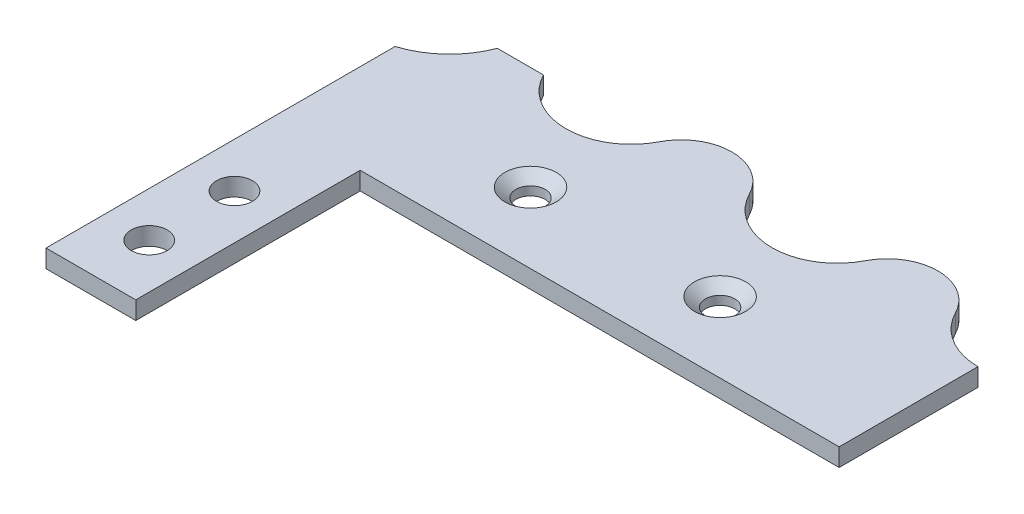
ISO-10303-21;
HEADER;
FILE_DESCRIPTION(('STEP AP214'),'2;1');
FILE_NAME('part.step','',(''),(''),'','','');
FILE_SCHEMA(('AUTOMOTIVE_DESIGN { 1 0 10303 214 1 1 1 1 }'));
ENDSEC;
DATA;
#1=APPLICATION_CONTEXT('core data for automotive mechanical design processes');
#2=APPLICATION_PROTOCOL_DEFINITION('international standard','automotive_design',2000,#1);
#3=PRODUCT_CONTEXT('',#1,'mechanical');
#4=PRODUCT('Part','Part','',(#3));
#5=PRODUCT_RELATED_PRODUCT_CATEGORY('part','',(#4));
#6=PRODUCT_DEFINITION_FORMATION('','',#4);
#7=PRODUCT_DEFINITION_CONTEXT('part definition',#1,'design');
#8=PRODUCT_DEFINITION('design','',#6,#7);
#9=PRODUCT_DEFINITION_SHAPE('','',#8);
#10=(LENGTH_UNIT() NAMED_UNIT(*) SI_UNIT(.MILLI.,.METRE.));
#11=(NAMED_UNIT(*) PLANE_ANGLE_UNIT() SI_UNIT($,.RADIAN.));
#12=(NAMED_UNIT(*) SI_UNIT($,.STERADIAN.) SOLID_ANGLE_UNIT());
#13=UNCERTAINTY_MEASURE_WITH_UNIT(LENGTH_MEASURE(1.E-05),#10,'distance_accuracy_value','');
#14=(GEOMETRIC_REPRESENTATION_CONTEXT(3) GLOBAL_UNCERTAINTY_ASSIGNED_CONTEXT((#13)) GLOBAL_UNIT_ASSIGNED_CONTEXT((#10,
#11,#12)) REPRESENTATION_CONTEXT('',''));
#15=CARTESIAN_POINT('',(0.,0.,0.));
#16=DIRECTION('',(0.,0.,1.));
#17=DIRECTION('',(1.,0.,0.));
#18=AXIS2_PLACEMENT_3D('',#15,#16,#17);
#19=CARTESIAN_POINT('',(11.475,-2.,5.88976892943899));
#20=DIRECTION('',(0.,1.,0.));
#21=DIRECTION('',(0.,0.,1.));
#22=AXIS2_PLACEMENT_3D('',#19,#20,#21);
#23=PLANE('',#22);
#24=CARTESIAN_POINT('',(1.83,-2.,14.86));
#25=DIRECTION('',(0.,1.,0.));
#26=DIRECTION('',(0.,0.,1.));
#27=AXIS2_PLACEMENT_3D('',#24,#25,#26);
#28=CIRCLE('',#27,1.63194999999999);
#29=CARTESIAN_POINT('',(1.83,-2.,16.49195));
#30=VERTEX_POINT('',#29);
#31=EDGE_CURVE('E501',#30,#30,#28,.F.);
#32=ORIENTED_EDGE('',*,*,#31,.F.);
#33=EDGE_LOOP('',(#32));
#34=FACE_BOUND('',#33,.T.);
#35=CARTESIAN_POINT('',(-35.41,-2.,41.22));
#36=DIRECTION('',(0.,1.,0.));
#37=DIRECTION('',(0.,0.,1.));
#38=AXIS2_PLACEMENT_3D('',#35,#36,#37);
#39=CIRCLE('',#38,2.00000000000001);
#40=CARTESIAN_POINT('',(-35.41,-2.,43.22));
#41=VERTEX_POINT('',#40);
#42=EDGE_CURVE('E180',#41,#41,#39,.F.);
#43=ORIENTED_EDGE('',*,*,#42,.F.);
#44=EDGE_LOOP('',(#43));
#45=FACE_BOUND('',#44,.T.);
#46=CARTESIAN_POINT('',(-35.41,-2.,31.72));
#47=DIRECTION('',(0.,1.,0.));
#48=DIRECTION('',(0.,0.,1.));
#49=AXIS2_PLACEMENT_3D('',#46,#47,#48);
#50=CIRCLE('',#49,2.00000000000001);
#51=CARTESIAN_POINT('',(-35.41,-2.,33.72));
#52=VERTEX_POINT('',#51);
#53=EDGE_CURVE('E298',#52,#52,#50,.F.);
#54=ORIENTED_EDGE('',*,*,#53,.F.);
#55=EDGE_LOOP('',(#54));
#56=FACE_BOUND('',#55,.T.);
#57=CARTESIAN_POINT('',(11.475,-2.,5.88976892943899));
#58=DIRECTION('',(0.,1.,0.));
#59=DIRECTION('',(0.,0.,1.));
#60=AXIS2_PLACEMENT_3D('',#57,#58,#59);
#61=CIRCLE('',#60,5.64825581395349);
#62=CARTESIAN_POINT('',(16.5,-2.,3.31058907144937));
#63=VERTEX_POINT('',#62);
#64=CARTESIAN_POINT('',(6.45,-2.,3.31058907144937));
#65=VERTEX_POINT('',#64);
#66=EDGE_CURVE('E220',#63,#65,#61,.T.);
#67=ORIENTED_EDGE('',*,*,#66,.F.);
#68=CARTESIAN_POINT('',(22.95,-2.,0.));
#69=DIRECTION('',(0.,-1.,0.));
#70=DIRECTION('',(0.,0.,1.));
#71=AXIS2_PLACEMENT_3D('',#68,#69,#70);
#72=CIRCLE('',#71,7.25);
#73=CARTESIAN_POINT('',(22.95,-2.,7.25));
#74=VERTEX_POINT('',#73);
#75=EDGE_CURVE('E161',#74,#63,#72,.T.);
#76=ORIENTED_EDGE('',*,*,#75,.F.);
#77=DIRECTION('',(0.,0.,-1.));
#78=VECTOR('',#77,1.);
#79=CARTESIAN_POINT('',(22.95,-2.,7.25));
#80=LINE('',#79,#78);
#81=CARTESIAN_POINT('',(22.95,-2.,22.72));
#82=VERTEX_POINT('',#81);
#83=EDGE_CURVE('E145',#82,#74,#80,.T.);
#84=ORIENTED_EDGE('',*,*,#83,.F.);
#85=DIRECTION('',(1.,0.,0.));
#86=VECTOR('',#85,1.);
#87=CARTESIAN_POINT('',(-30.41,-2.,22.72));
#88=LINE('',#87,#86);
#89=CARTESIAN_POINT('',(-30.41,-2.,22.72));
#90=VERTEX_POINT('',#89);
#91=EDGE_CURVE('E159',#90,#82,#88,.T.);
#92=ORIENTED_EDGE('',*,*,#91,.F.);
#93=DIRECTION('',(0.,0.,-1.));
#94=VECTOR('',#93,1.);
#95=CARTESIAN_POINT('',(-30.41,-2.,47.72));
#96=LINE('',#95,#94);
#97=CARTESIAN_POINT('',(-30.41,-2.,47.72));
#98=VERTEX_POINT('',#97);
#99=EDGE_CURVE('E166',#98,#90,#96,.T.);
#100=ORIENTED_EDGE('',*,*,#99,.F.);
#101=DIRECTION('',(1.,0.,0.));
#102=VECTOR('',#101,1.);
#103=CARTESIAN_POINT('',(-40.41,-2.,47.72));
#104=LINE('',#103,#102);
#105=CARTESIAN_POINT('',(-40.41,-2.,47.72));
#106=VERTEX_POINT('',#105);
#107=EDGE_CURVE('E169',#106,#98,#104,.T.);
#108=ORIENTED_EDGE('',*,*,#107,.F.);
#109=DIRECTION('',(0.,0.,1.));
#110=VECTOR('',#109,1.);
#111=CARTESIAN_POINT('',(-40.41,-2.,8.8294926680762));
#112=LINE('',#111,#110);
#113=CARTESIAN_POINT('',(-40.41,-2.,8.82949266807619));
#114=VERTEX_POINT('',#113);
#115=EDGE_CURVE('E332',#114,#106,#112,.T.);
#116=ORIENTED_EDGE('',*,*,#115,.F.);
#117=CARTESIAN_POINT('',(-43.1672738754771,-2.,0.));
#118=DIRECTION('',(0.,-1.,0.));
#119=DIRECTION('',(0.,0.,-1.));
#120=AXIS2_PLACEMENT_3D('',#117,#118,#119);
#121=CIRCLE('',#120,9.25);
#122=CARTESIAN_POINT('',(-34.53,-2.,3.31058907144937));
#123=VERTEX_POINT('',#122);
#124=EDGE_CURVE('E328',#123,#114,#121,.T.);
#125=ORIENTED_EDGE('',*,*,#124,.F.);
#126=DIRECTION('',(-1.,0.,0.));
#127=VECTOR('',#126,1.);
#128=CARTESIAN_POINT('',(-29.4,-2.,3.31058907144937));
#129=LINE('',#128,#127);
#130=CARTESIAN_POINT('',(-29.4,-2.,3.31058907144937));
#131=VERTEX_POINT('',#130);
#132=EDGE_CURVE('E324',#131,#123,#129,.T.);
#133=ORIENTED_EDGE('',*,*,#132,.F.);
#134=CARTESIAN_POINT('',(-22.95,-2.,0.));
#135=DIRECTION('',(0.,-1.,0.));
#136=DIRECTION('',(0.,0.,-1.));
#137=AXIS2_PLACEMENT_3D('',#134,#135,#136);
#138=CIRCLE('',#137,7.25);
#139=CARTESIAN_POINT('',(-16.5,-2.,3.31058907144937));
#140=VERTEX_POINT('',#139);
#141=EDGE_CURVE('E320',#140,#131,#138,.T.);
#142=ORIENTED_EDGE('',*,*,#141,.F.);
#143=CARTESIAN_POINT('',(-11.475,-2.,5.88976892943899));
#144=DIRECTION('',(0.,1.,0.));
#145=DIRECTION('',(0.,0.,-1.));
#146=AXIS2_PLACEMENT_3D('',#143,#144,#145);
#147=CIRCLE('',#146,5.64825581395349);
#148=CARTESIAN_POINT('',(-6.45,-2.,3.31058907144937));
#149=VERTEX_POINT('',#148);
#150=EDGE_CURVE('E316',#149,#140,#147,.T.);
#151=ORIENTED_EDGE('',*,*,#150,.F.);
#152=CARTESIAN_POINT('',(0.,-2.,0.));
#153=DIRECTION('',(0.,-1.,0.));
#154=DIRECTION('',(0.,0.,-1.));
#155=AXIS2_PLACEMENT_3D('',#152,#153,#154);
#156=CIRCLE('',#155,7.25);
#157=EDGE_CURVE('E313',#65,#149,#156,.T.);
#158=ORIENTED_EDGE('',*,*,#157,.F.);
#159=EDGE_LOOP('',(#67,#76,#84,#92,#100,#108,#116,#125,#133,#142,#151,#158));
#160=FACE_BOUND('',#159,.T.);
#161=CARTESIAN_POINT('',(-19.29,-2.,14.86));
#162=DIRECTION('',(0.,1.,0.));
#163=DIRECTION('',(0.,0.,1.));
#164=AXIS2_PLACEMENT_3D('',#161,#162,#163);
#165=CIRCLE('',#164,1.63194999999999);
#166=CARTESIAN_POINT('',(-19.29,-2.,16.49195));
#167=VERTEX_POINT('',#166);
#168=EDGE_CURVE('E299',#167,#167,#165,.F.);
#169=ORIENTED_EDGE('',*,*,#168,.F.);
#170=EDGE_LOOP('',(#169));
#171=FACE_BOUND('',#170,.T.);
#172=ADVANCED_FACE('F47',(#34,#45,#56,#160,#171),#23,.F.);
#173=CARTESIAN_POINT('',(11.475,-2.,5.88976892943899));
#174=DIRECTION('',(0.,1.,0.));
#175=DIRECTION('',(0.,0.,1.));
#176=AXIS2_PLACEMENT_3D('',#173,#174,#175);
#177=CYLINDRICAL_SURFACE('',#176,5.64825581395349);
#178=CARTESIAN_POINT('',(11.475,0.,5.88976892943899));
#179=DIRECTION('',(0.,1.,0.));
#180=DIRECTION('',(0.,0.,1.));
#181=AXIS2_PLACEMENT_3D('',#178,#179,#180);
#182=CIRCLE('',#181,5.64825581395349);
#183=CARTESIAN_POINT('',(16.5,0.,3.31058907144937));
#184=VERTEX_POINT('',#183);
#185=CARTESIAN_POINT('',(6.45,0.,3.31058907144937));
#186=VERTEX_POINT('',#185);
#187=EDGE_CURVE('E175',#184,#186,#182,.T.);
#188=ORIENTED_EDGE('',*,*,#187,.F.);
#189=DIRECTION('',(0.,1.,0.));
#190=VECTOR('',#189,1.);
#191=CARTESIAN_POINT('',(16.5,-2.,3.31058907144937));
#192=LINE('',#191,#190);
#193=EDGE_CURVE('E11',#63,#184,#192,.T.);
#194=ORIENTED_EDGE('',*,*,#193,.F.);
#195=ORIENTED_EDGE('',*,*,#66,.T.);
#196=DIRECTION('',(0.,1.,0.));
#197=VECTOR('',#196,1.);
#198=CARTESIAN_POINT('',(6.45,-2.,3.31058907144937));
#199=LINE('',#198,#197);
#200=EDGE_CURVE('E51',#65,#186,#199,.T.);
#201=ORIENTED_EDGE('',*,*,#200,.T.);
#202=EDGE_LOOP('',(#188,#194,#195,#201));
#203=FACE_BOUND('',#202,.T.);
#204=ADVANCED_FACE('F49',(#203),#177,.T.);
#205=CARTESIAN_POINT('',(22.95,-2.,0.));
#206=DIRECTION('',(0.,1.,0.));
#207=DIRECTION('',(0.,0.,1.));
#208=AXIS2_PLACEMENT_3D('',#205,#206,#207);
#209=CYLINDRICAL_SURFACE('',#208,7.25);
#210=CARTESIAN_POINT('',(22.95,0.,0.));
#211=DIRECTION('',(0.,-1.,0.));
#212=DIRECTION('',(0.,0.,1.));
#213=AXIS2_PLACEMENT_3D('',#210,#211,#212);
#214=CIRCLE('',#213,7.25);
#215=CARTESIAN_POINT('',(22.95,0.,7.25));
#216=VERTEX_POINT('',#215);
#217=EDGE_CURVE('E217',#216,#184,#214,.T.);
#218=ORIENTED_EDGE('',*,*,#217,.F.);
#219=DIRECTION('',(0.,1.,0.));
#220=VECTOR('',#219,1.);
#221=CARTESIAN_POINT('',(22.95,-2.,7.25));
#222=LINE('',#221,#220);
#223=EDGE_CURVE('E58',#74,#216,#222,.T.);
#224=ORIENTED_EDGE('',*,*,#223,.F.);
#225=ORIENTED_EDGE('',*,*,#75,.T.);
#226=ORIENTED_EDGE('',*,*,#193,.T.);
#227=EDGE_LOOP('',(#218,#224,#225,#226));
#228=FACE_BOUND('',#227,.T.);
#229=ADVANCED_FACE('F251',(#228),#209,.F.);
#230=CARTESIAN_POINT('',(22.95,-2.,7.25));
#231=DIRECTION('',(1.,0.,0.));
#232=DIRECTION('',(0.,0.,-1.));
#233=AXIS2_PLACEMENT_3D('',#230,#231,#232);
#234=PLANE('',#233);
#235=DIRECTION('',(0.,0.,-1.));
#236=VECTOR('',#235,1.);
#237=CARTESIAN_POINT('',(22.95,0.,7.25));
#238=LINE('',#237,#236);
#239=CARTESIAN_POINT('',(22.95,0.,22.72));
#240=VERTEX_POINT('',#239);
#241=EDGE_CURVE('E147',#240,#216,#238,.T.);
#242=ORIENTED_EDGE('',*,*,#241,.F.);
#243=DIRECTION('',(0.,1.,0.));
#244=VECTOR('',#243,1.);
#245=CARTESIAN_POINT('',(22.95,-2.,22.72));
#246=LINE('',#245,#244);
#247=EDGE_CURVE('E142',#82,#240,#246,.T.);
#248=ORIENTED_EDGE('',*,*,#247,.F.);
#249=ORIENTED_EDGE('',*,*,#83,.T.);
#250=ORIENTED_EDGE('',*,*,#223,.T.);
#251=EDGE_LOOP('',(#242,#248,#249,#250));
#252=FACE_BOUND('',#251,.T.);
#253=ADVANCED_FACE('F144',(#252),#234,.T.);
#254=CARTESIAN_POINT('',(-30.41,-2.,22.72));
#255=DIRECTION('',(0.,0.,1.));
#256=DIRECTION('',(1.,0.,0.));
#257=AXIS2_PLACEMENT_3D('',#254,#255,#256);
#258=PLANE('',#257);
#259=DIRECTION('',(1.,0.,0.));
#260=VECTOR('',#259,1.);
#261=CARTESIAN_POINT('',(-30.41,0.,22.72));
#262=LINE('',#261,#260);
#263=CARTESIAN_POINT('',(-30.41,0.,22.72));
#264=VERTEX_POINT('',#263);
#265=EDGE_CURVE('E212',#264,#240,#262,.T.);
#266=ORIENTED_EDGE('',*,*,#265,.F.);
#267=DIRECTION('',(0.,1.,0.));
#268=VECTOR('',#267,1.);
#269=CARTESIAN_POINT('',(-30.41,-2.,22.72));
#270=LINE('',#269,#268);
#271=EDGE_CURVE('E153',#90,#264,#270,.T.);
#272=ORIENTED_EDGE('',*,*,#271,.F.);
#273=ORIENTED_EDGE('',*,*,#91,.T.);
#274=ORIENTED_EDGE('',*,*,#247,.T.);
#275=EDGE_LOOP('',(#266,#272,#273,#274));
#276=FACE_BOUND('',#275,.T.);
#277=ADVANCED_FACE('F164',(#276),#258,.T.);
#278=CARTESIAN_POINT('',(-30.41,-2.,47.72));
#279=DIRECTION('',(1.,0.,0.));
#280=DIRECTION('',(0.,0.,-1.));
#281=AXIS2_PLACEMENT_3D('',#278,#279,#280);
#282=PLANE('',#281);
#283=DIRECTION('',(0.,0.,-1.));
#284=VECTOR('',#283,1.);
#285=CARTESIAN_POINT('',(-30.41,0.,47.72));
#286=LINE('',#285,#284);
#287=CARTESIAN_POINT('',(-30.41,0.,47.72));
#288=VERTEX_POINT('',#287);
#289=EDGE_CURVE('E208',#288,#264,#286,.T.);
#290=ORIENTED_EDGE('',*,*,#289,.F.);
#291=DIRECTION('',(0.,1.,0.));
#292=VECTOR('',#291,1.);
#293=CARTESIAN_POINT('',(-30.41,-2.,47.72));
#294=LINE('',#293,#292);
#295=EDGE_CURVE('E226',#98,#288,#294,.T.);
#296=ORIENTED_EDGE('',*,*,#295,.F.);
#297=ORIENTED_EDGE('',*,*,#99,.T.);
#298=ORIENTED_EDGE('',*,*,#271,.T.);
#299=EDGE_LOOP('',(#290,#296,#297,#298));
#300=FACE_BOUND('',#299,.T.);
#301=ADVANCED_FACE('F345',(#300),#282,.T.);
#302=CARTESIAN_POINT('',(-40.41,-2.,47.72));
#303=DIRECTION('',(0.,0.,1.));
#304=DIRECTION('',(1.,0.,0.));
#305=AXIS2_PLACEMENT_3D('',#302,#303,#304);
#306=PLANE('',#305);
#307=DIRECTION('',(1.,0.,0.));
#308=VECTOR('',#307,1.);
#309=CARTESIAN_POINT('',(-40.41,0.,47.72));
#310=LINE('',#309,#308);
#311=CARTESIAN_POINT('',(-40.41,0.,47.72));
#312=VERTEX_POINT('',#311);
#313=EDGE_CURVE('E204',#312,#288,#310,.T.);
#314=ORIENTED_EDGE('',*,*,#313,.F.);
#315=DIRECTION('',(0.,1.,0.));
#316=VECTOR('',#315,1.);
#317=CARTESIAN_POINT('',(-40.41,-2.,47.72));
#318=LINE('',#317,#316);
#319=EDGE_CURVE('E229',#106,#312,#318,.T.);
#320=ORIENTED_EDGE('',*,*,#319,.F.);
#321=ORIENTED_EDGE('',*,*,#107,.T.);
#322=ORIENTED_EDGE('',*,*,#295,.T.);
#323=EDGE_LOOP('',(#314,#320,#321,#322));
#324=FACE_BOUND('',#323,.T.);
#325=ADVANCED_FACE('F340',(#324),#306,.T.);
#326=CARTESIAN_POINT('',(-40.41,-2.,22.72));
#327=DIRECTION('',(-1.,0.,0.));
#328=DIRECTION('',(0.,0.,1.));
#329=AXIS2_PLACEMENT_3D('',#326,#327,#328);
#330=PLANE('',#329);
#331=DIRECTION('',(0.,0.,1.));
#332=VECTOR('',#331,1.);
#333=CARTESIAN_POINT('',(-40.41,0.,22.72));
#334=LINE('',#333,#332);
#335=CARTESIAN_POINT('',(-40.41,0.,8.82949266807619));
#336=VERTEX_POINT('',#335);
#337=EDGE_CURVE('E200',#336,#312,#334,.T.);
#338=ORIENTED_EDGE('',*,*,#337,.F.);
#339=DIRECTION('',(0.,1.,0.));
#340=VECTOR('',#339,1.);
#341=CARTESIAN_POINT('',(-40.41,-2.,8.82949266807619));
#342=LINE('',#341,#340);
#343=EDGE_CURVE('E232',#114,#336,#342,.T.);
#344=ORIENTED_EDGE('',*,*,#343,.F.);
#345=ORIENTED_EDGE('',*,*,#115,.T.);
#346=ORIENTED_EDGE('',*,*,#319,.T.);
#347=EDGE_LOOP('',(#338,#344,#345,#346));
#348=FACE_BOUND('',#347,.T.);
#349=ADVANCED_FACE('F348',(#348),#330,.T.);
#350=CARTESIAN_POINT('',(-43.1672738754771,-2.,0.));
#351=DIRECTION('',(0.,1.,0.));
#352=DIRECTION('',(0.,0.,1.));
#353=AXIS2_PLACEMENT_3D('',#350,#351,#352);
#354=CYLINDRICAL_SURFACE('',#353,9.25);
#355=CARTESIAN_POINT('',(-43.1672738754771,0.,0.));
#356=DIRECTION('',(0.,-1.,0.));
#357=DIRECTION('',(0.,0.,-1.));
#358=AXIS2_PLACEMENT_3D('',#355,#356,#357);
#359=CIRCLE('',#358,9.25);
#360=CARTESIAN_POINT('',(-34.53,0.,3.31058907144937));
#361=VERTEX_POINT('',#360);
#362=EDGE_CURVE('E196',#361,#336,#359,.T.);
#363=ORIENTED_EDGE('',*,*,#362,.F.);
#364=DIRECTION('',(0.,1.,0.));
#365=VECTOR('',#364,1.);
#366=CARTESIAN_POINT('',(-34.53,-2.,3.31058907144937));
#367=LINE('',#366,#365);
#368=EDGE_CURVE('E236',#123,#361,#367,.T.);
#369=ORIENTED_EDGE('',*,*,#368,.F.);
#370=ORIENTED_EDGE('',*,*,#124,.T.);
#371=ORIENTED_EDGE('',*,*,#343,.T.);
#372=EDGE_LOOP('',(#363,#369,#370,#371));
#373=FACE_BOUND('',#372,.T.);
#374=ADVANCED_FACE('F350',(#373),#354,.F.);
#375=CARTESIAN_POINT('',(-29.4,-2.,3.31058907144937));
#376=DIRECTION('',(0.,0.,-1.));
#377=DIRECTION('',(-1.,0.,0.));
#378=AXIS2_PLACEMENT_3D('',#375,#376,#377);
#379=PLANE('',#378);
#380=DIRECTION('',(-1.,0.,0.));
#381=VECTOR('',#380,1.);
#382=CARTESIAN_POINT('',(-29.4,0.,3.31058907144937));
#383=LINE('',#382,#381);
#384=CARTESIAN_POINT('',(-29.4,0.,3.31058907144937));
#385=VERTEX_POINT('',#384);
#386=EDGE_CURVE('E192',#385,#361,#383,.T.);
#387=ORIENTED_EDGE('',*,*,#386,.F.);
#388=DIRECTION('',(0.,1.,0.));
#389=VECTOR('',#388,1.);
#390=CARTESIAN_POINT('',(-29.4,-2.,3.31058907144937));
#391=LINE('',#390,#389);
#392=EDGE_CURVE('E239',#131,#385,#391,.T.);
#393=ORIENTED_EDGE('',*,*,#392,.F.);
#394=ORIENTED_EDGE('',*,*,#132,.T.);
#395=ORIENTED_EDGE('',*,*,#368,.T.);
#396=EDGE_LOOP('',(#387,#393,#394,#395));
#397=FACE_BOUND('',#396,.T.);
#398=ADVANCED_FACE('F355',(#397),#379,.T.);
#399=CARTESIAN_POINT('',(-22.95,-2.,0.));
#400=DIRECTION('',(0.,1.,0.));
#401=DIRECTION('',(0.,0.,1.));
#402=AXIS2_PLACEMENT_3D('',#399,#400,#401);
#403=CYLINDRICAL_SURFACE('',#402,7.25);
#404=CARTESIAN_POINT('',(-22.95,0.,0.));
#405=DIRECTION('',(0.,-1.,0.));
#406=DIRECTION('',(0.,0.,-1.));
#407=AXIS2_PLACEMENT_3D('',#404,#405,#406);
#408=CIRCLE('',#407,7.25);
#409=CARTESIAN_POINT('',(-16.5,0.,3.31058907144937));
#410=VERTEX_POINT('',#409);
#411=EDGE_CURVE('E188',#410,#385,#408,.T.);
#412=ORIENTED_EDGE('',*,*,#411,.F.);
#413=DIRECTION('',(0.,1.,0.));
#414=VECTOR('',#413,1.);
#415=CARTESIAN_POINT('',(-16.5,-2.,3.31058907144937));
#416=LINE('',#415,#414);
#417=EDGE_CURVE('E242',#140,#410,#416,.T.);
#418=ORIENTED_EDGE('',*,*,#417,.F.);
#419=ORIENTED_EDGE('',*,*,#141,.T.);
#420=ORIENTED_EDGE('',*,*,#392,.T.);
#421=EDGE_LOOP('',(#412,#418,#419,#420));
#422=FACE_BOUND('',#421,.T.);
#423=ADVANCED_FACE('F358',(#422),#403,.F.);
#424=CARTESIAN_POINT('',(-11.475,-2.,5.88976892943899));
#425=DIRECTION('',(0.,1.,0.));
#426=DIRECTION('',(0.,0.,1.));
#427=AXIS2_PLACEMENT_3D('',#424,#425,#426);
#428=CYLINDRICAL_SURFACE('',#427,5.64825581395349);
#429=CARTESIAN_POINT('',(-11.475,0.,5.88976892943899));
#430=DIRECTION('',(0.,1.,0.));
#431=DIRECTION('',(0.,0.,-1.));
#432=AXIS2_PLACEMENT_3D('',#429,#430,#431);
#433=CIRCLE('',#432,5.64825581395349);
#434=CARTESIAN_POINT('',(-6.45,0.,3.31058907144937));
#435=VERTEX_POINT('',#434);
#436=EDGE_CURVE('E184',#435,#410,#433,.T.);
#437=ORIENTED_EDGE('',*,*,#436,.F.);
#438=DIRECTION('',(0.,1.,0.));
#439=VECTOR('',#438,1.);
#440=CARTESIAN_POINT('',(-6.45,-2.,3.31058907144937));
#441=LINE('',#440,#439);
#442=EDGE_CURVE('E244',#149,#435,#441,.T.);
#443=ORIENTED_EDGE('',*,*,#442,.F.);
#444=ORIENTED_EDGE('',*,*,#150,.T.);
#445=ORIENTED_EDGE('',*,*,#417,.T.);
#446=EDGE_LOOP('',(#437,#443,#444,#445));
#447=FACE_BOUND('',#446,.T.);
#448=ADVANCED_FACE('F280',(#447),#428,.T.);
#449=CARTESIAN_POINT('',(0.,-2.,0.));
#450=DIRECTION('',(0.,1.,0.));
#451=DIRECTION('',(0.,0.,1.));
#452=AXIS2_PLACEMENT_3D('',#449,#450,#451);
#453=CYLINDRICAL_SURFACE('',#452,7.25);
#454=CARTESIAN_POINT('',(0.,0.,0.));
#455=DIRECTION('',(0.,-1.,0.));
#456=DIRECTION('',(0.,0.,-1.));
#457=AXIS2_PLACEMENT_3D('',#454,#455,#456);
#458=CIRCLE('',#457,7.25);
#459=EDGE_CURVE('E179',#186,#435,#458,.T.);
#460=ORIENTED_EDGE('',*,*,#459,.F.);
#461=ORIENTED_EDGE('',*,*,#200,.F.);
#462=ORIENTED_EDGE('',*,*,#157,.T.);
#463=ORIENTED_EDGE('',*,*,#442,.T.);
#464=EDGE_LOOP('',(#460,#461,#462,#463));
#465=FACE_BOUND('',#464,.T.);
#466=ADVANCED_FACE('F248',(#465),#453,.F.);
#467=CARTESIAN_POINT('',(11.475,0.,5.88976892943899));
#468=DIRECTION('',(0.,1.,0.));
#469=DIRECTION('',(0.,0.,1.));
#470=AXIS2_PLACEMENT_3D('',#467,#468,#469);
#471=PLANE('',#470);
#472=CARTESIAN_POINT('',(1.83,0.,14.86));
#473=DIRECTION('',(0.,1.,0.));
#474=DIRECTION('',(0.,0.,1.));
#475=AXIS2_PLACEMENT_3D('',#472,#473,#474);
#476=CIRCLE('',#475,2.8575);
#477=CARTESIAN_POINT('',(1.83,0.,17.7175));
#478=VERTEX_POINT('',#477);
#479=EDGE_CURVE('E284',#478,#478,#476,.T.);
#480=ORIENTED_EDGE('',*,*,#479,.F.);
#481=EDGE_LOOP('',(#480));
#482=FACE_BOUND('',#481,.T.);
#483=CARTESIAN_POINT('',(-19.29,0.,14.86));
#484=DIRECTION('',(0.,1.,0.));
#485=DIRECTION('',(0.,0.,1.));
#486=AXIS2_PLACEMENT_3D('',#483,#484,#485);
#487=CIRCLE('',#486,2.8575);
#488=CARTESIAN_POINT('',(-19.29,0.,17.7175));
#489=VERTEX_POINT('',#488);
#490=EDGE_CURVE('E288',#489,#489,#487,.T.);
#491=ORIENTED_EDGE('',*,*,#490,.F.);
#492=EDGE_LOOP('',(#491));
#493=FACE_BOUND('',#492,.T.);
#494=CARTESIAN_POINT('',(-35.41,0.,41.22));
#495=DIRECTION('',(0.,1.,0.));
#496=DIRECTION('',(0.,0.,1.));
#497=AXIS2_PLACEMENT_3D('',#494,#495,#496);
#498=CIRCLE('',#497,2.00000000000001);
#499=CARTESIAN_POINT('',(-35.41,0.,43.22));
#500=VERTEX_POINT('',#499);
#501=EDGE_CURVE('E292',#500,#500,#498,.T.);
#502=ORIENTED_EDGE('',*,*,#501,.F.);
#503=EDGE_LOOP('',(#502));
#504=FACE_BOUND('',#503,.T.);
#505=CARTESIAN_POINT('',(-35.41,0.,31.72));
#506=DIRECTION('',(0.,1.,0.));
#507=DIRECTION('',(0.,0.,1.));
#508=AXIS2_PLACEMENT_3D('',#505,#506,#507);
#509=CIRCLE('',#508,2.00000000000001);
#510=CARTESIAN_POINT('',(-35.41,0.,33.72));
#511=VERTEX_POINT('',#510);
#512=EDGE_CURVE('E295',#511,#511,#509,.T.);
#513=ORIENTED_EDGE('',*,*,#512,.F.);
#514=EDGE_LOOP('',(#513));
#515=FACE_BOUND('',#514,.T.);
#516=ORIENTED_EDGE('',*,*,#187,.T.);
#517=ORIENTED_EDGE('',*,*,#459,.T.);
#518=ORIENTED_EDGE('',*,*,#436,.T.);
#519=ORIENTED_EDGE('',*,*,#411,.T.);
#520=ORIENTED_EDGE('',*,*,#386,.T.);
#521=ORIENTED_EDGE('',*,*,#362,.T.);
#522=ORIENTED_EDGE('',*,*,#337,.T.);
#523=ORIENTED_EDGE('',*,*,#313,.T.);
#524=ORIENTED_EDGE('',*,*,#289,.T.);
#525=ORIENTED_EDGE('',*,*,#265,.T.);
#526=ORIENTED_EDGE('',*,*,#241,.T.);
#527=ORIENTED_EDGE('',*,*,#217,.T.);
#528=EDGE_LOOP('',(#516,#517,#518,#519,#520,#521,#522,#523,#524,#525,#526,#527));
#529=FACE_BOUND('',#528,.T.);
#530=ADVANCED_FACE('F250',(#482,#493,#504,#515,#529),#471,.T.);
#531=CARTESIAN_POINT('',(-35.41,-7.65685424949241,31.72));
#532=DIRECTION('',(0.,1.,0.));
#533=DIRECTION('',(0.,0.,1.));
#534=AXIS2_PLACEMENT_3D('',#531,#532,#533);
#535=CYLINDRICAL_SURFACE('',#534,2.00000000000001);
#536=ORIENTED_EDGE('',*,*,#53,.T.);
#537=EDGE_LOOP('',(#536));
#538=FACE_BOUND('',#537,.T.);
#539=ORIENTED_EDGE('',*,*,#512,.T.);
#540=EDGE_LOOP('',(#539));
#541=FACE_BOUND('',#540,.T.);
#542=ADVANCED_FACE('F270',(#538,#541),#535,.F.);
#543=CARTESIAN_POINT('',(-35.41,-7.65685424949241,41.22));
#544=DIRECTION('',(0.,1.,0.));
#545=DIRECTION('',(0.,0.,1.));
#546=AXIS2_PLACEMENT_3D('',#543,#544,#545);
#547=CYLINDRICAL_SURFACE('',#546,2.00000000000001);
#548=ORIENTED_EDGE('',*,*,#42,.T.);
#549=EDGE_LOOP('',(#548));
#550=FACE_BOUND('',#549,.T.);
#551=ORIENTED_EDGE('',*,*,#501,.T.);
#552=EDGE_LOOP('',(#551));
#553=FACE_BOUND('',#552,.T.);
#554=ADVANCED_FACE('F277',(#550,#553),#547,.F.);
#555=CARTESIAN_POINT('',(-19.29,0.,14.86));
#556=DIRECTION('',(0.,1.,0.));
#557=DIRECTION('',(0.,0.,1.));
#558=AXIS2_PLACEMENT_3D('',#555,#556,#557);
#559=CYLINDRICAL_SURFACE('',#558,1.63194999999999);
#560=ORIENTED_EDGE('',*,*,#168,.T.);
#561=EDGE_LOOP('',(#560));
#562=FACE_BOUND('',#561,.T.);
#563=CARTESIAN_POINT('',(-19.29,-1.02835855298933,14.86));
#564=DIRECTION('',(0.,1.,0.));
#565=DIRECTION('',(0.,0.,1.));
#566=AXIS2_PLACEMENT_3D('',#563,#564,#565);
#567=CIRCLE('',#566,1.63194999999999);
#568=CARTESIAN_POINT('',(-19.29,-1.02835855298933,16.49195));
#569=VERTEX_POINT('',#568);
#570=EDGE_CURVE('E306',#569,#569,#567,.T.);
#571=ORIENTED_EDGE('',*,*,#570,.T.);
#572=EDGE_LOOP('',(#571));
#573=FACE_BOUND('',#572,.T.);
#574=ADVANCED_FACE('F447',(#562,#573),#559,.F.);
#575=CARTESIAN_POINT('',(-19.29,0.,14.86));
#576=DIRECTION('',(0.,1.,0.));
#577=DIRECTION('',(0.,0.,1.));
#578=AXIS2_PLACEMENT_3D('',#575,#576,#577);
#579=CONICAL_SURFACE('',#578,2.8575,0.872664625997163);
#580=ORIENTED_EDGE('',*,*,#570,.F.);
#581=EDGE_LOOP('',(#580));
#582=FACE_BOUND('',#581,.T.);
#583=ORIENTED_EDGE('',*,*,#490,.T.);
#584=EDGE_LOOP('',(#583));
#585=FACE_BOUND('',#584,.T.);
#586=ADVANCED_FACE('F461',(#582,#585),#579,.F.);
#587=CARTESIAN_POINT('',(1.83,0.,14.86));
#588=DIRECTION('',(0.,1.,0.));
#589=DIRECTION('',(0.,0.,1.));
#590=AXIS2_PLACEMENT_3D('',#587,#588,#589);
#591=CYLINDRICAL_SURFACE('',#590,1.63194999999999);
#592=ORIENTED_EDGE('',*,*,#31,.T.);
#593=EDGE_LOOP('',(#592));
#594=FACE_BOUND('',#593,.T.);
#595=CARTESIAN_POINT('',(1.83,-1.02835855298933,14.86));
#596=DIRECTION('',(0.,1.,0.));
#597=DIRECTION('',(0.,0.,1.));
#598=AXIS2_PLACEMENT_3D('',#595,#596,#597);
#599=CIRCLE('',#598,1.63194999999999);
#600=CARTESIAN_POINT('',(1.83,-1.02835855298933,16.49195));
#601=VERTEX_POINT('',#600);
#602=EDGE_CURVE('E497',#601,#601,#599,.T.);
#603=ORIENTED_EDGE('',*,*,#602,.T.);
#604=EDGE_LOOP('',(#603));
#605=FACE_BOUND('',#604,.T.);
#606=ADVANCED_FACE('F471',(#594,#605),#591,.F.);
#607=CARTESIAN_POINT('',(1.83,0.,14.86));
#608=DIRECTION('',(0.,1.,0.));
#609=DIRECTION('',(0.,0.,1.));
#610=AXIS2_PLACEMENT_3D('',#607,#608,#609);
#611=CONICAL_SURFACE('',#610,2.8575,0.872664625997162);
#612=ORIENTED_EDGE('',*,*,#602,.F.);
#613=EDGE_LOOP('',(#612));
#614=FACE_BOUND('',#613,.T.);
#615=ORIENTED_EDGE('',*,*,#479,.T.);
#616=EDGE_LOOP('',(#615));
#617=FACE_BOUND('',#616,.T.);
#618=ADVANCED_FACE('F481',(#614,#617),#611,.F.);
#619=CLOSED_SHELL('',(#172,#204,#229,#253,#277,#301,#325,#349,#374,#398,#423,#448,#466,#530,
#542,#554,#574,#586,#606,#618));
#620=MANIFOLD_SOLID_BREP('B2',#619);
#621=ADVANCED_BREP_SHAPE_REPRESENTATION('',(#18,#620),#14);
#622=SHAPE_DEFINITION_REPRESENTATION(#9,#621);
ENDSEC;
END-ISO-10303-21;
